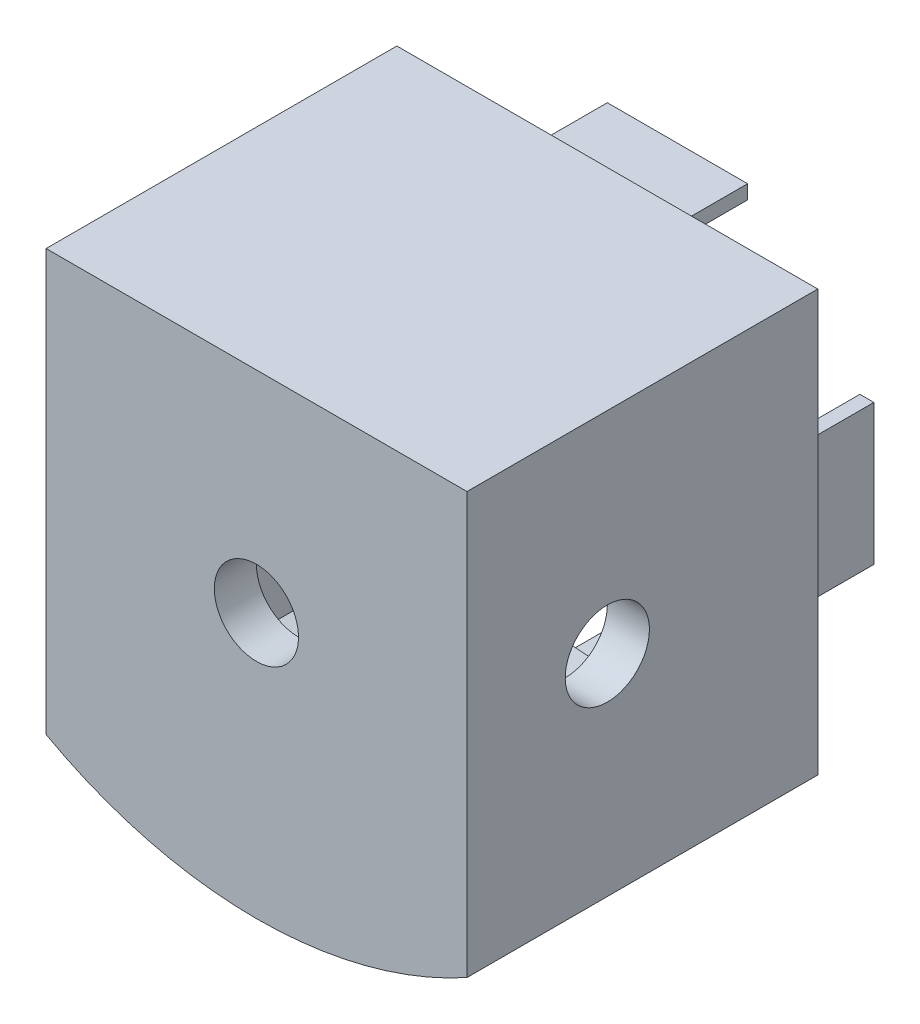
ISO-10303-21;
HEADER;
FILE_DESCRIPTION(('STEP AP214'),'2;1');
FILE_NAME('part.step','',(''),(''),'','','');
FILE_SCHEMA(('AUTOMOTIVE_DESIGN { 1 0 10303 214 1 1 1 1 }'));
ENDSEC;
DATA;
#1=APPLICATION_CONTEXT('core data for automotive mechanical design processes');
#2=APPLICATION_PROTOCOL_DEFINITION('international standard','automotive_design',2000,#1);
#3=PRODUCT_CONTEXT('',#1,'mechanical');
#4=PRODUCT('Part','Part','',(#3));
#5=PRODUCT_RELATED_PRODUCT_CATEGORY('part','',(#4));
#6=PRODUCT_DEFINITION_FORMATION('','',#4);
#7=PRODUCT_DEFINITION_CONTEXT('part definition',#1,'design');
#8=PRODUCT_DEFINITION('design','',#6,#7);
#9=PRODUCT_DEFINITION_SHAPE('','',#8);
#10=(LENGTH_UNIT() NAMED_UNIT(*) SI_UNIT(.MILLI.,.METRE.));
#11=(NAMED_UNIT(*) PLANE_ANGLE_UNIT() SI_UNIT($,.RADIAN.));
#12=(NAMED_UNIT(*) SI_UNIT($,.STERADIAN.) SOLID_ANGLE_UNIT());
#13=UNCERTAINTY_MEASURE_WITH_UNIT(LENGTH_MEASURE(1.E-05),#10,'distance_accuracy_value','');
#14=(GEOMETRIC_REPRESENTATION_CONTEXT(3) GLOBAL_UNCERTAINTY_ASSIGNED_CONTEXT((#13)) GLOBAL_UNIT_ASSIGNED_CONTEXT((#10,
#11,#12)) REPRESENTATION_CONTEXT('',''));
#15=CARTESIAN_POINT('',(0.,0.,0.));
#16=DIRECTION('',(0.,0.,1.));
#17=DIRECTION('',(1.,0.,0.));
#18=AXIS2_PLACEMENT_3D('',#15,#16,#17);
#19=CARTESIAN_POINT('',(0.,12.1293199325011,0.));
#20=DIRECTION('',(0.,0.,1.));
#21=DIRECTION('',(1.,0.,0.));
#22=AXIS2_PLACEMENT_3D('',#19,#20,#21);
#23=PLANE('',#22);
#24=DIRECTION('',(0.,-1.,0.));
#25=VECTOR('',#24,1.);
#26=CARTESIAN_POINT('',(3.5,-17.,0.));
#27=LINE('',#26,#25);
#28=CARTESIAN_POINT('',(3.5,-17.,0.));
#29=VERTEX_POINT('',#28);
#30=CARTESIAN_POINT('',(3.5,-18.,0.));
#31=VERTEX_POINT('',#30);
#32=EDGE_CURVE('E218',#29,#31,#27,.T.);
#33=ORIENTED_EDGE('',*,*,#32,.F.);
#34=DIRECTION('',(1.,0.,0.));
#35=VECTOR('',#34,1.);
#36=CARTESIAN_POINT('',(3.5,-17.,0.));
#37=LINE('',#36,#35);
#38=CARTESIAN_POINT('',(-3.5,-17.,0.));
#39=VERTEX_POINT('',#38);
#40=EDGE_CURVE('E231',#39,#29,#37,.T.);
#41=ORIENTED_EDGE('',*,*,#40,.F.);
#42=DIRECTION('',(0.,1.,0.));
#43=VECTOR('',#42,1.);
#44=CARTESIAN_POINT('',(-3.5,-17.,0.));
#45=LINE('',#44,#43);
#46=CARTESIAN_POINT('',(-3.5,-18.,0.));
#47=VERTEX_POINT('',#46);
#48=EDGE_CURVE('E240',#47,#39,#45,.T.);
#49=ORIENTED_EDGE('',*,*,#48,.F.);
#50=DIRECTION('',(-1.,0.,0.));
#51=VECTOR('',#50,1.);
#52=CARTESIAN_POINT('',(3.5,-18.,0.));
#53=LINE('',#52,#51);
#54=EDGE_CURVE('E221',#31,#47,#53,.T.);
#55=ORIENTED_EDGE('',*,*,#54,.F.);
#56=EDGE_LOOP('',(#33,#41,#49,#55));
#57=FACE_BOUND('',#56,.T.);
#58=DIRECTION('',(0.,-1.,0.));
#59=VECTOR('',#58,1.);
#60=CARTESIAN_POINT('',(5.,14.,0.));
#61=LINE('',#60,#59);
#62=CARTESIAN_POINT('',(5.,14.,0.));
#63=VERTEX_POINT('',#62);
#64=CARTESIAN_POINT('',(5.,13.,0.));
#65=VERTEX_POINT('',#64);
#66=EDGE_CURVE('E289',#63,#65,#61,.T.);
#67=ORIENTED_EDGE('',*,*,#66,.F.);
#68=DIRECTION('',(1.,0.,0.));
#69=VECTOR('',#68,1.);
#70=CARTESIAN_POINT('',(5.,14.,0.));
#71=LINE('',#70,#69);
#72=CARTESIAN_POINT('',(-5.,14.,0.));
#73=VERTEX_POINT('',#72);
#74=EDGE_CURVE('E294',#73,#63,#71,.T.);
#75=ORIENTED_EDGE('',*,*,#74,.F.);
#76=DIRECTION('',(0.,1.,0.));
#77=VECTOR('',#76,1.);
#78=CARTESIAN_POINT('',(-5.,14.,0.));
#79=LINE('',#78,#77);
#80=CARTESIAN_POINT('',(-5.,13.,0.));
#81=VERTEX_POINT('',#80);
#82=EDGE_CURVE('E306',#81,#73,#79,.T.);
#83=ORIENTED_EDGE('',*,*,#82,.F.);
#84=DIRECTION('',(-1.,0.,0.));
#85=VECTOR('',#84,1.);
#86=CARTESIAN_POINT('',(5.,13.,0.));
#87=LINE('',#86,#85);
#88=EDGE_CURVE('E303',#65,#81,#87,.T.);
#89=ORIENTED_EDGE('',*,*,#88,.F.);
#90=EDGE_LOOP('',(#67,#75,#83,#89));
#91=FACE_BOUND('',#90,.T.);
#92=DIRECTION('',(-1.,0.,0.));
#93=VECTOR('',#92,1.);
#94=CARTESIAN_POINT('',(15.,12.,0.));
#95=LINE('',#94,#93);
#96=CARTESIAN_POINT('',(12.,12.,0.));
#97=VERTEX_POINT('',#96);
#98=CARTESIAN_POINT('',(-12.,12.,0.));
#99=VERTEX_POINT('',#98);
#100=EDGE_CURVE('E338',#97,#99,#95,.T.);
#101=ORIENTED_EDGE('',*,*,#100,.T.);
#102=DIRECTION('',(0.,-1.,0.));
#103=VECTOR('',#102,1.);
#104=CARTESIAN_POINT('',(-12.,-15.,0.));
#105=LINE('',#104,#103);
#106=CARTESIAN_POINT('',(-12.,-13.1689013488459,0.));
#107=VERTEX_POINT('',#106);
#108=EDGE_CURVE('E326',#99,#107,#105,.T.);
#109=ORIENTED_EDGE('',*,*,#108,.T.);
#110=CARTESIAN_POINT('',(0.,12.1293199325011,0.));
#111=DIRECTION('',(0.,0.,1.));
#112=DIRECTION('',(1.,0.,0.));
#113=AXIS2_PLACEMENT_3D('',#110,#111,#112);
#114=CIRCLE('',#113,28.);
#115=CARTESIAN_POINT('',(12.,-13.168901348846,0.));
#116=VERTEX_POINT('',#115);
#117=EDGE_CURVE('E352',#107,#116,#114,.T.);
#118=ORIENTED_EDGE('',*,*,#117,.T.);
#119=DIRECTION('',(0.,1.,0.));
#120=VECTOR('',#119,1.);
#121=CARTESIAN_POINT('',(12.,-15.,0.));
#122=LINE('',#121,#120);
#123=EDGE_CURVE('E355',#116,#97,#122,.T.);
#124=ORIENTED_EDGE('',*,*,#123,.T.);
#125=EDGE_LOOP('',(#101,#109,#118,#124));
#126=FACE_BOUND('',#125,.T.);
#127=DIRECTION('',(0.,-1.,0.));
#128=VECTOR('',#127,1.);
#129=CARTESIAN_POINT('',(-15.,-15.,0.));
#130=LINE('',#129,#128);
#131=CARTESIAN_POINT('',(-15.,15.,0.));
#132=VERTEX_POINT('',#131);
#133=CARTESIAN_POINT('',(-15.,-15.,0.));
#134=VERTEX_POINT('',#133);
#135=EDGE_CURVE('E332',#132,#134,#130,.T.);
#136=ORIENTED_EDGE('',*,*,#135,.F.);
#137=DIRECTION('',(-1.,0.,0.));
#138=VECTOR('',#137,1.);
#139=CARTESIAN_POINT('',(15.,15.,0.));
#140=LINE('',#139,#138);
#141=CARTESIAN_POINT('',(15.,15.,0.));
#142=VERTEX_POINT('',#141);
#143=EDGE_CURVE('E364',#142,#132,#140,.T.);
#144=ORIENTED_EDGE('',*,*,#143,.F.);
#145=DIRECTION('',(0.,1.,0.));
#146=VECTOR('',#145,1.);
#147=CARTESIAN_POINT('',(15.,-15.,0.));
#148=LINE('',#147,#146);
#149=CARTESIAN_POINT('',(15.,-15.,0.));
#150=VERTEX_POINT('',#149);
#151=EDGE_CURVE('E375',#150,#142,#148,.T.);
#152=ORIENTED_EDGE('',*,*,#151,.F.);
#153=CARTESIAN_POINT('',(0.,12.1293199325011,0.));
#154=DIRECTION('',(0.,0.,1.));
#155=DIRECTION('',(1.,0.,0.));
#156=AXIS2_PLACEMENT_3D('',#153,#154,#155);
#157=CIRCLE('',#156,31.);
#158=EDGE_CURVE('E373',#134,#150,#157,.T.);
#159=ORIENTED_EDGE('',*,*,#158,.F.);
#160=EDGE_LOOP('',(#136,#144,#152,#159));
#161=FACE_BOUND('',#160,.T.);
#162=DIRECTION('',(0.,-1.,0.));
#163=VECTOR('',#162,1.);
#164=CARTESIAN_POINT('',(14.,5.,0.));
#165=LINE('',#164,#163);
#166=CARTESIAN_POINT('',(14.,5.,0.));
#167=VERTEX_POINT('',#166);
#168=CARTESIAN_POINT('',(14.,-5.,0.));
#169=VERTEX_POINT('',#168);
#170=EDGE_CURVE('E256',#167,#169,#165,.T.);
#171=ORIENTED_EDGE('',*,*,#170,.F.);
#172=DIRECTION('',(1.,0.,0.));
#173=VECTOR('',#172,1.);
#174=CARTESIAN_POINT('',(14.,5.,0.));
#175=LINE('',#174,#173);
#176=CARTESIAN_POINT('',(13.,5.,0.));
#177=VERTEX_POINT('',#176);
#178=EDGE_CURVE('E261',#177,#167,#175,.T.);
#179=ORIENTED_EDGE('',*,*,#178,.F.);
#180=DIRECTION('',(0.,1.,0.));
#181=VECTOR('',#180,1.);
#182=CARTESIAN_POINT('',(13.,5.,0.));
#183=LINE('',#182,#181);
#184=CARTESIAN_POINT('',(13.,-5.,0.));
#185=VERTEX_POINT('',#184);
#186=EDGE_CURVE('E273',#185,#177,#183,.T.);
#187=ORIENTED_EDGE('',*,*,#186,.F.);
#188=DIRECTION('',(-1.,0.,0.));
#189=VECTOR('',#188,1.);
#190=CARTESIAN_POINT('',(14.,-5.,0.));
#191=LINE('',#190,#189);
#192=EDGE_CURVE('E270',#169,#185,#191,.T.);
#193=ORIENTED_EDGE('',*,*,#192,.F.);
#194=EDGE_LOOP('',(#171,#179,#187,#193));
#195=FACE_BOUND('',#194,.T.);
#196=DIRECTION('',(0.,-1.,0.));
#197=VECTOR('',#196,1.);
#198=CARTESIAN_POINT('',(-13.,5.,0.));
#199=LINE('',#198,#197);
#200=CARTESIAN_POINT('',(-13.,5.,0.));
#201=VERTEX_POINT('',#200);
#202=CARTESIAN_POINT('',(-13.,-5.,0.));
#203=VERTEX_POINT('',#202);
#204=EDGE_CURVE('E217',#201,#203,#199,.T.);
#205=ORIENTED_EDGE('',*,*,#204,.F.);
#206=DIRECTION('',(1.,0.,0.));
#207=VECTOR('',#206,1.);
#208=CARTESIAN_POINT('',(-13.,5.,0.));
#209=LINE('',#208,#207);
#210=CARTESIAN_POINT('',(-14.,5.,0.));
#211=VERTEX_POINT('',#210);
#212=EDGE_CURVE('E214',#211,#201,#209,.T.);
#213=ORIENTED_EDGE('',*,*,#212,.F.);
#214=DIRECTION('',(0.,1.,0.));
#215=VECTOR('',#214,1.);
#216=CARTESIAN_POINT('',(-14.,5.,0.));
#217=LINE('',#216,#215);
#218=CARTESIAN_POINT('',(-14.,-5.,0.));
#219=VERTEX_POINT('',#218);
#220=EDGE_CURVE('E56',#219,#211,#217,.T.);
#221=ORIENTED_EDGE('',*,*,#220,.F.);
#222=DIRECTION('',(-1.,0.,0.));
#223=VECTOR('',#222,1.);
#224=CARTESIAN_POINT('',(-13.,-5.,0.));
#225=LINE('',#224,#223);
#226=EDGE_CURVE('E51',#203,#219,#225,.T.);
#227=ORIENTED_EDGE('',*,*,#226,.F.);
#228=EDGE_LOOP('',(#205,#213,#221,#227));
#229=FACE_BOUND('',#228,.T.);
#230=ADVANCED_FACE('F35',(#57,#91,#126,#161,#195,#229),#23,.F.);
#231=CARTESIAN_POINT('',(-15.,-15.,25.));
#232=DIRECTION('',(1.,0.,0.));
#233=DIRECTION('',(0.,1.,0.));
#234=AXIS2_PLACEMENT_3D('',#231,#232,#233);
#235=PLANE('',#234);
#236=CARTESIAN_POINT('',(-15.,0.,15.));
#237=DIRECTION('',(1.,0.,0.));
#238=DIRECTION('',(0.,1.,0.));
#239=AXIS2_PLACEMENT_3D('',#236,#237,#238);
#240=CIRCLE('',#239,3.);
#241=CARTESIAN_POINT('',(-15.,3.,15.));
#242=VERTEX_POINT('',#241);
#243=EDGE_CURVE('E562',#242,#242,#240,.T.);
#244=ORIENTED_EDGE('',*,*,#243,.T.);
#245=EDGE_LOOP('',(#244));
#246=FACE_BOUND('',#245,.T.);
#247=ORIENTED_EDGE('',*,*,#135,.T.);
#248=DIRECTION('',(0.,0.,-1.));
#249=VECTOR('',#248,1.);
#250=CARTESIAN_POINT('',(-15.,-15.,25.));
#251=LINE('',#250,#249);
#252=CARTESIAN_POINT('',(-15.,-15.,25.));
#253=VERTEX_POINT('',#252);
#254=EDGE_CURVE('E11',#253,#134,#251,.T.);
#255=ORIENTED_EDGE('',*,*,#254,.F.);
#256=DIRECTION('',(0.,-1.,0.));
#257=VECTOR('',#256,1.);
#258=CARTESIAN_POINT('',(-15.,-15.,25.));
#259=LINE('',#258,#257);
#260=CARTESIAN_POINT('',(-15.,15.,25.));
#261=VERTEX_POINT('',#260);
#262=EDGE_CURVE('E360',#261,#253,#259,.T.);
#263=ORIENTED_EDGE('',*,*,#262,.F.);
#264=DIRECTION('',(0.,0.,-1.));
#265=VECTOR('',#264,1.);
#266=CARTESIAN_POINT('',(-15.,15.,25.));
#267=LINE('',#266,#265);
#268=EDGE_CURVE('E370',#261,#132,#267,.T.);
#269=ORIENTED_EDGE('',*,*,#268,.T.);
#270=EDGE_LOOP('',(#247,#255,#263,#269));
#271=FACE_BOUND('',#270,.T.);
#272=ADVANCED_FACE('F37',(#246,#271),#235,.F.);
#273=CARTESIAN_POINT('',(0.,12.1293199325011,25.));
#274=DIRECTION('',(0.,0.,-1.));
#275=DIRECTION('',(-1.,0.,0.));
#276=AXIS2_PLACEMENT_3D('',#273,#274,#275);
#277=CYLINDRICAL_SURFACE('',#276,31.);
#278=ORIENTED_EDGE('',*,*,#158,.T.);
#279=DIRECTION('',(0.,0.,-1.));
#280=VECTOR('',#279,1.);
#281=CARTESIAN_POINT('',(15.,-15.,25.));
#282=LINE('',#281,#280);
#283=CARTESIAN_POINT('',(15.,-15.,25.));
#284=VERTEX_POINT('',#283);
#285=EDGE_CURVE('E44',#284,#150,#282,.T.);
#286=ORIENTED_EDGE('',*,*,#285,.F.);
#287=CARTESIAN_POINT('',(0.,12.1293199325011,25.));
#288=DIRECTION('',(0.,0.,1.));
#289=DIRECTION('',(1.,0.,0.));
#290=AXIS2_PLACEMENT_3D('',#287,#288,#289);
#291=CIRCLE('',#290,31.);
#292=EDGE_CURVE('E363',#253,#284,#291,.T.);
#293=ORIENTED_EDGE('',*,*,#292,.F.);
#294=ORIENTED_EDGE('',*,*,#254,.T.);
#295=EDGE_LOOP('',(#278,#286,#293,#294));
#296=FACE_BOUND('',#295,.T.);
#297=ADVANCED_FACE('F404',(#296),#277,.T.);
#298=CARTESIAN_POINT('',(15.,-15.,25.));
#299=DIRECTION('',(-1.,0.,0.));
#300=DIRECTION('',(0.,-1.,0.));
#301=AXIS2_PLACEMENT_3D('',#298,#299,#300);
#302=PLANE('',#301);
#303=CARTESIAN_POINT('',(15.,0.,15.));
#304=DIRECTION('',(1.,0.,0.));
#305=DIRECTION('',(0.,1.,0.));
#306=AXIS2_PLACEMENT_3D('',#303,#304,#305);
#307=CIRCLE('',#306,3.);
#308=CARTESIAN_POINT('',(15.,3.,15.));
#309=VERTEX_POINT('',#308);
#310=EDGE_CURVE('E561',#309,#309,#307,.T.);
#311=ORIENTED_EDGE('',*,*,#310,.F.);
#312=EDGE_LOOP('',(#311));
#313=FACE_BOUND('',#312,.T.);
#314=ORIENTED_EDGE('',*,*,#151,.T.);
#315=DIRECTION('',(0.,0.,-1.));
#316=VECTOR('',#315,1.);
#317=CARTESIAN_POINT('',(15.,15.,25.));
#318=LINE('',#317,#316);
#319=CARTESIAN_POINT('',(15.,15.,25.));
#320=VERTEX_POINT('',#319);
#321=EDGE_CURVE('E380',#320,#142,#318,.T.);
#322=ORIENTED_EDGE('',*,*,#321,.F.);
#323=DIRECTION('',(0.,1.,0.));
#324=VECTOR('',#323,1.);
#325=CARTESIAN_POINT('',(15.,-15.,25.));
#326=LINE('',#325,#324);
#327=EDGE_CURVE('E366',#284,#320,#326,.T.);
#328=ORIENTED_EDGE('',*,*,#327,.F.);
#329=ORIENTED_EDGE('',*,*,#285,.T.);
#330=EDGE_LOOP('',(#314,#322,#328,#329));
#331=FACE_BOUND('',#330,.T.);
#332=ADVANCED_FACE('F388',(#313,#331),#302,.F.);
#333=CARTESIAN_POINT('',(15.,15.,25.));
#334=DIRECTION('',(0.,-1.,0.));
#335=DIRECTION('',(0.,0.,-1.));
#336=AXIS2_PLACEMENT_3D('',#333,#334,#335);
#337=PLANE('',#336);
#338=ORIENTED_EDGE('',*,*,#143,.T.);
#339=ORIENTED_EDGE('',*,*,#268,.F.);
#340=DIRECTION('',(-1.,0.,0.));
#341=VECTOR('',#340,1.);
#342=CARTESIAN_POINT('',(15.,15.,25.));
#343=LINE('',#342,#341);
#344=EDGE_CURVE('E368',#320,#261,#343,.T.);
#345=ORIENTED_EDGE('',*,*,#344,.F.);
#346=ORIENTED_EDGE('',*,*,#321,.T.);
#347=EDGE_LOOP('',(#338,#339,#345,#346));
#348=FACE_BOUND('',#347,.T.);
#349=ADVANCED_FACE('F397',(#348),#337,.F.);
#350=CARTESIAN_POINT('',(0.,12.1293199325011,25.));
#351=DIRECTION('',(0.,0.,1.));
#352=DIRECTION('',(1.,0.,0.));
#353=AXIS2_PLACEMENT_3D('',#350,#351,#352);
#354=PLANE('',#353);
#355=CARTESIAN_POINT('',(-0.0102597379063596,0.00757269740248034,25.));
#356=DIRECTION('',(0.,0.,-1.));
#357=DIRECTION('',(-1.,0.,0.));
#358=AXIS2_PLACEMENT_3D('',#355,#356,#357);
#359=CIRCLE('',#358,3.);
#360=CARTESIAN_POINT('',(-3.01025973790636,0.00757269740248034,25.));
#361=VERTEX_POINT('',#360);
#362=EDGE_CURVE('E323',#361,#361,#359,.T.);
#363=ORIENTED_EDGE('',*,*,#362,.T.);
#364=EDGE_LOOP('',(#363));
#365=FACE_BOUND('',#364,.T.);
#366=ORIENTED_EDGE('',*,*,#262,.T.);
#367=ORIENTED_EDGE('',*,*,#292,.T.);
#368=ORIENTED_EDGE('',*,*,#327,.T.);
#369=ORIENTED_EDGE('',*,*,#344,.T.);
#370=EDGE_LOOP('',(#366,#367,#368,#369));
#371=FACE_BOUND('',#370,.T.);
#372=ADVANCED_FACE('F403',(#365,#371),#354,.T.);
#373=CARTESIAN_POINT('',(-12.,-15.,25.));
#374=DIRECTION('',(1.,0.,0.));
#375=DIRECTION('',(0.,1.,0.));
#376=AXIS2_PLACEMENT_3D('',#373,#374,#375);
#377=PLANE('',#376);
#378=CARTESIAN_POINT('',(-12.,0.,15.));
#379=DIRECTION('',(1.,0.,0.));
#380=DIRECTION('',(0.,1.,0.));
#381=AXIS2_PLACEMENT_3D('',#378,#379,#380);
#382=CIRCLE('',#381,3.);
#383=CARTESIAN_POINT('',(-12.,3.,15.));
#384=VERTEX_POINT('',#383);
#385=EDGE_CURVE('E567',#384,#384,#382,.T.);
#386=ORIENTED_EDGE('',*,*,#385,.F.);
#387=EDGE_LOOP('',(#386));
#388=FACE_BOUND('',#387,.T.);
#389=ORIENTED_EDGE('',*,*,#108,.F.);
#390=DIRECTION('',(0.,0.,-1.));
#391=VECTOR('',#390,1.);
#392=CARTESIAN_POINT('',(-12.,12.,25.));
#393=LINE('',#392,#391);
#394=CARTESIAN_POINT('',(-12.,12.,22.));
#395=VERTEX_POINT('',#394);
#396=EDGE_CURVE('E339',#395,#99,#393,.T.);
#397=ORIENTED_EDGE('',*,*,#396,.F.);
#398=DIRECTION('',(0.,-1.,0.));
#399=VECTOR('',#398,1.);
#400=CARTESIAN_POINT('',(-12.,-15.,22.));
#401=LINE('',#400,#399);
#402=CARTESIAN_POINT('',(-12.,-13.1689013488459,22.));
#403=VERTEX_POINT('',#402);
#404=EDGE_CURVE('E334',#395,#403,#401,.T.);
#405=ORIENTED_EDGE('',*,*,#404,.T.);
#406=DIRECTION('',(0.,0.,-1.));
#407=VECTOR('',#406,1.);
#408=CARTESIAN_POINT('',(-12.,-13.1689013488459,22.));
#409=LINE('',#408,#407);
#410=EDGE_CURVE('E329',#403,#107,#409,.T.);
#411=ORIENTED_EDGE('',*,*,#410,.T.);
#412=EDGE_LOOP('',(#389,#397,#405,#411));
#413=FACE_BOUND('',#412,.T.);
#414=ADVANCED_FACE('F428',(#388,#413),#377,.T.);
#415=CARTESIAN_POINT('',(0.,12.1293199325011,25.));
#416=DIRECTION('',(0.,0.,-1.));
#417=DIRECTION('',(-1.,0.,0.));
#418=AXIS2_PLACEMENT_3D('',#415,#416,#417);
#419=CYLINDRICAL_SURFACE('',#418,28.);
#420=ORIENTED_EDGE('',*,*,#117,.F.);
#421=ORIENTED_EDGE('',*,*,#410,.F.);
#422=CARTESIAN_POINT('',(0.,12.1293199325011,22.));
#423=DIRECTION('',(0.,0.,1.));
#424=DIRECTION('',(1.,0.,0.));
#425=AXIS2_PLACEMENT_3D('',#422,#423,#424);
#426=CIRCLE('',#425,28.);
#427=CARTESIAN_POINT('',(12.,-13.168901348846,22.));
#428=VERTEX_POINT('',#427);
#429=EDGE_CURVE('E337',#403,#428,#426,.T.);
#430=ORIENTED_EDGE('',*,*,#429,.T.);
#431=DIRECTION('',(0.,0.,-1.));
#432=VECTOR('',#431,1.);
#433=CARTESIAN_POINT('',(12.,-13.168901348846,22.));
#434=LINE('',#433,#432);
#435=EDGE_CURVE('E333',#428,#116,#434,.T.);
#436=ORIENTED_EDGE('',*,*,#435,.T.);
#437=EDGE_LOOP('',(#420,#421,#430,#436));
#438=FACE_BOUND('',#437,.T.);
#439=ADVANCED_FACE('F434',(#438),#419,.F.);
#440=CARTESIAN_POINT('',(12.,-15.,25.));
#441=DIRECTION('',(-1.,0.,0.));
#442=DIRECTION('',(0.,-1.,0.));
#443=AXIS2_PLACEMENT_3D('',#440,#441,#442);
#444=PLANE('',#443);
#445=CARTESIAN_POINT('',(12.,0.,15.));
#446=DIRECTION('',(-1.,0.,0.));
#447=DIRECTION('',(0.,-1.,0.));
#448=AXIS2_PLACEMENT_3D('',#445,#446,#447);
#449=CIRCLE('',#448,3.);
#450=CARTESIAN_POINT('',(12.,-3.,15.));
#451=VERTEX_POINT('',#450);
#452=EDGE_CURVE('E39',#451,#451,#449,.T.);
#453=ORIENTED_EDGE('',*,*,#452,.F.);
#454=EDGE_LOOP('',(#453));
#455=FACE_BOUND('',#454,.T.);
#456=ORIENTED_EDGE('',*,*,#123,.F.);
#457=ORIENTED_EDGE('',*,*,#435,.F.);
#458=DIRECTION('',(0.,1.,0.));
#459=VECTOR('',#458,1.);
#460=CARTESIAN_POINT('',(12.,-15.,22.));
#461=LINE('',#460,#459);
#462=CARTESIAN_POINT('',(12.,12.,22.));
#463=VERTEX_POINT('',#462);
#464=EDGE_CURVE('E346',#428,#463,#461,.T.);
#465=ORIENTED_EDGE('',*,*,#464,.T.);
#466=DIRECTION('',(0.,0.,-1.));
#467=VECTOR('',#466,1.);
#468=CARTESIAN_POINT('',(12.,12.,25.));
#469=LINE('',#468,#467);
#470=EDGE_CURVE('E341',#463,#97,#469,.T.);
#471=ORIENTED_EDGE('',*,*,#470,.T.);
#472=EDGE_LOOP('',(#456,#457,#465,#471));
#473=FACE_BOUND('',#472,.T.);
#474=ADVANCED_FACE('F464',(#455,#473),#444,.T.);
#475=CARTESIAN_POINT('',(15.,12.,25.));
#476=DIRECTION('',(0.,-1.,0.));
#477=DIRECTION('',(0.,0.,-1.));
#478=AXIS2_PLACEMENT_3D('',#475,#476,#477);
#479=PLANE('',#478);
#480=ORIENTED_EDGE('',*,*,#100,.F.);
#481=ORIENTED_EDGE('',*,*,#470,.F.);
#482=DIRECTION('',(-1.,0.,0.));
#483=VECTOR('',#482,1.);
#484=CARTESIAN_POINT('',(15.,12.,22.));
#485=LINE('',#484,#483);
#486=EDGE_CURVE('E342',#463,#395,#485,.T.);
#487=ORIENTED_EDGE('',*,*,#486,.T.);
#488=ORIENTED_EDGE('',*,*,#396,.T.);
#489=EDGE_LOOP('',(#480,#481,#487,#488));
#490=FACE_BOUND('',#489,.T.);
#491=ADVANCED_FACE('F449',(#490),#479,.T.);
#492=CARTESIAN_POINT('',(0.,12.1293199325011,22.));
#493=DIRECTION('',(0.,0.,1.));
#494=DIRECTION('',(1.,0.,0.));
#495=AXIS2_PLACEMENT_3D('',#492,#493,#494);
#496=PLANE('',#495);
#497=CARTESIAN_POINT('',(-0.0102597379063596,0.00757269740248034,22.));
#498=DIRECTION('',(0.,0.,-1.));
#499=DIRECTION('',(-1.,0.,0.));
#500=AXIS2_PLACEMENT_3D('',#497,#498,#499);
#501=CIRCLE('',#500,3.);
#502=CARTESIAN_POINT('',(-3.01025973790636,0.00757269740248034,22.));
#503=VERTEX_POINT('',#502);
#504=EDGE_CURVE('E322',#503,#503,#501,.T.);
#505=ORIENTED_EDGE('',*,*,#504,.F.);
#506=EDGE_LOOP('',(#505));
#507=FACE_BOUND('',#506,.T.);
#508=ORIENTED_EDGE('',*,*,#404,.F.);
#509=ORIENTED_EDGE('',*,*,#486,.F.);
#510=ORIENTED_EDGE('',*,*,#464,.F.);
#511=ORIENTED_EDGE('',*,*,#429,.F.);
#512=EDGE_LOOP('',(#508,#509,#510,#511));
#513=FACE_BOUND('',#512,.T.);
#514=ADVANCED_FACE('F443',(#507,#513),#496,.F.);
#515=CARTESIAN_POINT('',(-0.0102597379063596,0.00757269740248034,25.));
#516=DIRECTION('',(0.,0.,-1.));
#517=DIRECTION('',(-1.,0.,0.));
#518=AXIS2_PLACEMENT_3D('',#515,#516,#517);
#519=CYLINDRICAL_SURFACE('',#518,3.);
#520=ORIENTED_EDGE('',*,*,#362,.F.);
#521=EDGE_LOOP('',(#520));
#522=FACE_BOUND('',#521,.T.);
#523=ORIENTED_EDGE('',*,*,#504,.T.);
#524=EDGE_LOOP('',(#523));
#525=FACE_BOUND('',#524,.T.);
#526=ADVANCED_FACE('F439',(#522,#525),#519,.F.);
#527=CARTESIAN_POINT('',(5.,14.,-5.));
#528=DIRECTION('',(-1.,0.,0.));
#529=DIRECTION('',(0.,0.,1.));
#530=AXIS2_PLACEMENT_3D('',#527,#528,#529);
#531=PLANE('',#530);
#532=ORIENTED_EDGE('',*,*,#66,.T.);
#533=DIRECTION('',(0.,0.,1.));
#534=VECTOR('',#533,1.);
#535=CARTESIAN_POINT('',(5.,13.,-5.));
#536=LINE('',#535,#534);
#537=CARTESIAN_POINT('',(5.,13.,-5.));
#538=VERTEX_POINT('',#537);
#539=EDGE_CURVE('E319',#538,#65,#536,.T.);
#540=ORIENTED_EDGE('',*,*,#539,.F.);
#541=DIRECTION('',(0.,-1.,0.));
#542=VECTOR('',#541,1.);
#543=CARTESIAN_POINT('',(5.,14.,-5.));
#544=LINE('',#543,#542);
#545=CARTESIAN_POINT('',(5.,14.,-5.));
#546=VERTEX_POINT('',#545);
#547=EDGE_CURVE('E290',#546,#538,#544,.T.);
#548=ORIENTED_EDGE('',*,*,#547,.F.);
#549=DIRECTION('',(0.,0.,1.));
#550=VECTOR('',#549,1.);
#551=CARTESIAN_POINT('',(5.,14.,-5.));
#552=LINE('',#551,#550);
#553=EDGE_CURVE('E300',#546,#63,#552,.T.);
#554=ORIENTED_EDGE('',*,*,#553,.T.);
#555=EDGE_LOOP('',(#532,#540,#548,#554));
#556=FACE_BOUND('',#555,.T.);
#557=ADVANCED_FACE('F442',(#556),#531,.F.);
#558=CARTESIAN_POINT('',(5.,13.,-5.));
#559=DIRECTION('',(0.,1.,0.));
#560=DIRECTION('',(0.,0.,1.));
#561=AXIS2_PLACEMENT_3D('',#558,#559,#560);
#562=PLANE('',#561);
#563=ORIENTED_EDGE('',*,*,#88,.T.);
#564=DIRECTION('',(0.,0.,1.));
#565=VECTOR('',#564,1.);
#566=CARTESIAN_POINT('',(-5.,13.,-5.));
#567=LINE('',#566,#565);
#568=CARTESIAN_POINT('',(-5.,13.,-5.));
#569=VERTEX_POINT('',#568);
#570=EDGE_CURVE('E316',#569,#81,#567,.T.);
#571=ORIENTED_EDGE('',*,*,#570,.F.);
#572=DIRECTION('',(-1.,0.,0.));
#573=VECTOR('',#572,1.);
#574=CARTESIAN_POINT('',(5.,13.,-5.));
#575=LINE('',#574,#573);
#576=EDGE_CURVE('E293',#538,#569,#575,.T.);
#577=ORIENTED_EDGE('',*,*,#576,.F.);
#578=ORIENTED_EDGE('',*,*,#539,.T.);
#579=EDGE_LOOP('',(#563,#571,#577,#578));
#580=FACE_BOUND('',#579,.T.);
#581=ADVANCED_FACE('F479',(#580),#562,.F.);
#582=CARTESIAN_POINT('',(-5.,14.,-5.));
#583=DIRECTION('',(1.,0.,0.));
#584=DIRECTION('',(0.,0.,-1.));
#585=AXIS2_PLACEMENT_3D('',#582,#583,#584);
#586=PLANE('',#585);
#587=ORIENTED_EDGE('',*,*,#82,.T.);
#588=DIRECTION('',(0.,0.,1.));
#589=VECTOR('',#588,1.);
#590=CARTESIAN_POINT('',(-5.,14.,-5.));
#591=LINE('',#590,#589);
#592=CARTESIAN_POINT('',(-5.,14.,-5.));
#593=VERTEX_POINT('',#592);
#594=EDGE_CURVE('E313',#593,#73,#591,.T.);
#595=ORIENTED_EDGE('',*,*,#594,.F.);
#596=DIRECTION('',(0.,1.,0.));
#597=VECTOR('',#596,1.);
#598=CARTESIAN_POINT('',(-5.,14.,-5.));
#599=LINE('',#598,#597);
#600=EDGE_CURVE('E296',#569,#593,#599,.T.);
#601=ORIENTED_EDGE('',*,*,#600,.F.);
#602=ORIENTED_EDGE('',*,*,#570,.T.);
#603=EDGE_LOOP('',(#587,#595,#601,#602));
#604=FACE_BOUND('',#603,.T.);
#605=ADVANCED_FACE('F483',(#604),#586,.F.);
#606=CARTESIAN_POINT('',(5.,14.,-5.));
#607=DIRECTION('',(0.,-1.,0.));
#608=DIRECTION('',(0.,0.,-1.));
#609=AXIS2_PLACEMENT_3D('',#606,#607,#608);
#610=PLANE('',#609);
#611=ORIENTED_EDGE('',*,*,#74,.T.);
#612=ORIENTED_EDGE('',*,*,#553,.F.);
#613=DIRECTION('',(1.,0.,0.));
#614=VECTOR('',#613,1.);
#615=CARTESIAN_POINT('',(5.,14.,-5.));
#616=LINE('',#615,#614);
#617=EDGE_CURVE('E298',#593,#546,#616,.T.);
#618=ORIENTED_EDGE('',*,*,#617,.F.);
#619=ORIENTED_EDGE('',*,*,#594,.T.);
#620=EDGE_LOOP('',(#611,#612,#618,#619));
#621=FACE_BOUND('',#620,.T.);
#622=ADVANCED_FACE('F487',(#621),#610,.F.);
#623=CARTESIAN_POINT('',(0.,0.,-5.));
#624=DIRECTION('',(0.,0.,-1.));
#625=DIRECTION('',(-1.,0.,0.));
#626=AXIS2_PLACEMENT_3D('',#623,#624,#625);
#627=PLANE('',#626);
#628=ORIENTED_EDGE('',*,*,#547,.T.);
#629=ORIENTED_EDGE('',*,*,#576,.T.);
#630=ORIENTED_EDGE('',*,*,#600,.T.);
#631=ORIENTED_EDGE('',*,*,#617,.T.);
#632=EDGE_LOOP('',(#628,#629,#630,#631));
#633=FACE_BOUND('',#632,.T.);
#634=ADVANCED_FACE('F491',(#633),#627,.T.);
#635=CARTESIAN_POINT('',(14.,5.,-5.));
#636=DIRECTION('',(-1.,0.,0.));
#637=DIRECTION('',(0.,0.,1.));
#638=AXIS2_PLACEMENT_3D('',#635,#636,#637);
#639=PLANE('',#638);
#640=ORIENTED_EDGE('',*,*,#170,.T.);
#641=DIRECTION('',(0.,0.,1.));
#642=VECTOR('',#641,1.);
#643=CARTESIAN_POINT('',(14.,-5.,-5.));
#644=LINE('',#643,#642);
#645=CARTESIAN_POINT('',(14.,-5.,-5.));
#646=VERTEX_POINT('',#645);
#647=EDGE_CURVE('E286',#646,#169,#644,.T.);
#648=ORIENTED_EDGE('',*,*,#647,.F.);
#649=DIRECTION('',(0.,-1.,0.));
#650=VECTOR('',#649,1.);
#651=CARTESIAN_POINT('',(14.,5.,-5.));
#652=LINE('',#651,#650);
#653=CARTESIAN_POINT('',(14.,5.,-5.));
#654=VERTEX_POINT('',#653);
#655=EDGE_CURVE('E257',#654,#646,#652,.T.);
#656=ORIENTED_EDGE('',*,*,#655,.F.);
#657=DIRECTION('',(0.,0.,1.));
#658=VECTOR('',#657,1.);
#659=CARTESIAN_POINT('',(14.,5.,-5.));
#660=LINE('',#659,#658);
#661=EDGE_CURVE('E267',#654,#167,#660,.T.);
#662=ORIENTED_EDGE('',*,*,#661,.T.);
#663=EDGE_LOOP('',(#640,#648,#656,#662));
#664=FACE_BOUND('',#663,.T.);
#665=ADVANCED_FACE('F495',(#664),#639,.F.);
#666=CARTESIAN_POINT('',(14.,-5.,-5.));
#667=DIRECTION('',(0.,1.,0.));
#668=DIRECTION('',(0.,0.,1.));
#669=AXIS2_PLACEMENT_3D('',#666,#667,#668);
#670=PLANE('',#669);
#671=ORIENTED_EDGE('',*,*,#192,.T.);
#672=DIRECTION('',(0.,0.,1.));
#673=VECTOR('',#672,1.);
#674=CARTESIAN_POINT('',(13.,-5.,-5.));
#675=LINE('',#674,#673);
#676=CARTESIAN_POINT('',(13.,-5.,-5.));
#677=VERTEX_POINT('',#676);
#678=EDGE_CURVE('E283',#677,#185,#675,.T.);
#679=ORIENTED_EDGE('',*,*,#678,.F.);
#680=DIRECTION('',(-1.,0.,0.));
#681=VECTOR('',#680,1.);
#682=CARTESIAN_POINT('',(14.,-5.,-5.));
#683=LINE('',#682,#681);
#684=EDGE_CURVE('E260',#646,#677,#683,.T.);
#685=ORIENTED_EDGE('',*,*,#684,.F.);
#686=ORIENTED_EDGE('',*,*,#647,.T.);
#687=EDGE_LOOP('',(#671,#679,#685,#686));
#688=FACE_BOUND('',#687,.T.);
#689=ADVANCED_FACE('F499',(#688),#670,.F.);
#690=CARTESIAN_POINT('',(13.,5.,-5.));
#691=DIRECTION('',(1.,0.,0.));
#692=DIRECTION('',(0.,0.,-1.));
#693=AXIS2_PLACEMENT_3D('',#690,#691,#692);
#694=PLANE('',#693);
#695=ORIENTED_EDGE('',*,*,#186,.T.);
#696=DIRECTION('',(0.,0.,1.));
#697=VECTOR('',#696,1.);
#698=CARTESIAN_POINT('',(13.,5.,-5.));
#699=LINE('',#698,#697);
#700=CARTESIAN_POINT('',(13.,5.,-5.));
#701=VERTEX_POINT('',#700);
#702=EDGE_CURVE('E280',#701,#177,#699,.T.);
#703=ORIENTED_EDGE('',*,*,#702,.F.);
#704=DIRECTION('',(0.,1.,0.));
#705=VECTOR('',#704,1.);
#706=CARTESIAN_POINT('',(13.,5.,-5.));
#707=LINE('',#706,#705);
#708=EDGE_CURVE('E263',#677,#701,#707,.T.);
#709=ORIENTED_EDGE('',*,*,#708,.F.);
#710=ORIENTED_EDGE('',*,*,#678,.T.);
#711=EDGE_LOOP('',(#695,#703,#709,#710));
#712=FACE_BOUND('',#711,.T.);
#713=ADVANCED_FACE('F503',(#712),#694,.F.);
#714=CARTESIAN_POINT('',(14.,5.,-5.));
#715=DIRECTION('',(0.,-1.,0.));
#716=DIRECTION('',(0.,0.,-1.));
#717=AXIS2_PLACEMENT_3D('',#714,#715,#716);
#718=PLANE('',#717);
#719=ORIENTED_EDGE('',*,*,#178,.T.);
#720=ORIENTED_EDGE('',*,*,#661,.F.);
#721=DIRECTION('',(1.,0.,0.));
#722=VECTOR('',#721,1.);
#723=CARTESIAN_POINT('',(14.,5.,-5.));
#724=LINE('',#723,#722);
#725=EDGE_CURVE('E265',#701,#654,#724,.T.);
#726=ORIENTED_EDGE('',*,*,#725,.F.);
#727=ORIENTED_EDGE('',*,*,#702,.T.);
#728=EDGE_LOOP('',(#719,#720,#726,#727));
#729=FACE_BOUND('',#728,.T.);
#730=ADVANCED_FACE('F507',(#729),#718,.F.);
#731=CARTESIAN_POINT('',(0.,0.,-5.));
#732=DIRECTION('',(0.,0.,-1.));
#733=DIRECTION('',(-1.,0.,0.));
#734=AXIS2_PLACEMENT_3D('',#731,#732,#733);
#735=PLANE('',#734);
#736=ORIENTED_EDGE('',*,*,#655,.T.);
#737=ORIENTED_EDGE('',*,*,#684,.T.);
#738=ORIENTED_EDGE('',*,*,#708,.T.);
#739=ORIENTED_EDGE('',*,*,#725,.T.);
#740=EDGE_LOOP('',(#736,#737,#738,#739));
#741=FACE_BOUND('',#740,.T.);
#742=ADVANCED_FACE('F511',(#741),#735,.T.);
#743=CARTESIAN_POINT('',(3.5,-17.,-5.));
#744=DIRECTION('',(-1.,0.,0.));
#745=DIRECTION('',(0.,0.,1.));
#746=AXIS2_PLACEMENT_3D('',#743,#744,#745);
#747=PLANE('',#746);
#748=ORIENTED_EDGE('',*,*,#32,.T.);
#749=DIRECTION('',(0.,0.,1.));
#750=VECTOR('',#749,1.);
#751=CARTESIAN_POINT('',(3.5,-18.,-5.));
#752=LINE('',#751,#750);
#753=CARTESIAN_POINT('',(3.5,-18.,-5.));
#754=VERTEX_POINT('',#753);
#755=EDGE_CURVE('E253',#754,#31,#752,.T.);
#756=ORIENTED_EDGE('',*,*,#755,.F.);
#757=DIRECTION('',(0.,-1.,0.));
#758=VECTOR('',#757,1.);
#759=CARTESIAN_POINT('',(3.5,-17.,-5.));
#760=LINE('',#759,#758);
#761=CARTESIAN_POINT('',(3.5,-17.,-5.));
#762=VERTEX_POINT('',#761);
#763=EDGE_CURVE('E227',#762,#754,#760,.T.);
#764=ORIENTED_EDGE('',*,*,#763,.F.);
#765=DIRECTION('',(0.,0.,1.));
#766=VECTOR('',#765,1.);
#767=CARTESIAN_POINT('',(3.5,-17.,-5.));
#768=LINE('',#767,#766);
#769=EDGE_CURVE('E236',#762,#29,#768,.T.);
#770=ORIENTED_EDGE('',*,*,#769,.T.);
#771=EDGE_LOOP('',(#748,#756,#764,#770));
#772=FACE_BOUND('',#771,.T.);
#773=ADVANCED_FACE('F515',(#772),#747,.F.);
#774=CARTESIAN_POINT('',(3.5,-18.,-5.));
#775=DIRECTION('',(0.,1.,0.));
#776=DIRECTION('',(0.,0.,1.));
#777=AXIS2_PLACEMENT_3D('',#774,#775,#776);
#778=PLANE('',#777);
#779=ORIENTED_EDGE('',*,*,#54,.T.);
#780=DIRECTION('',(0.,0.,1.));
#781=VECTOR('',#780,1.);
#782=CARTESIAN_POINT('',(-3.5,-18.,-5.));
#783=LINE('',#782,#781);
#784=CARTESIAN_POINT('',(-3.5,-18.,-5.));
#785=VERTEX_POINT('',#784);
#786=EDGE_CURVE('E250',#785,#47,#783,.T.);
#787=ORIENTED_EDGE('',*,*,#786,.F.);
#788=DIRECTION('',(-1.,0.,0.));
#789=VECTOR('',#788,1.);
#790=CARTESIAN_POINT('',(3.5,-18.,-5.));
#791=LINE('',#790,#789);
#792=EDGE_CURVE('E230',#754,#785,#791,.T.);
#793=ORIENTED_EDGE('',*,*,#792,.F.);
#794=ORIENTED_EDGE('',*,*,#755,.T.);
#795=EDGE_LOOP('',(#779,#787,#793,#794));
#796=FACE_BOUND('',#795,.T.);
#797=ADVANCED_FACE('F519',(#796),#778,.F.);
#798=CARTESIAN_POINT('',(-3.5,-17.,-5.));
#799=DIRECTION('',(1.,0.,0.));
#800=DIRECTION('',(0.,0.,-1.));
#801=AXIS2_PLACEMENT_3D('',#798,#799,#800);
#802=PLANE('',#801);
#803=ORIENTED_EDGE('',*,*,#48,.T.);
#804=DIRECTION('',(0.,0.,1.));
#805=VECTOR('',#804,1.);
#806=CARTESIAN_POINT('',(-3.5,-17.,-5.));
#807=LINE('',#806,#805);
#808=CARTESIAN_POINT('',(-3.5,-17.,-5.));
#809=VERTEX_POINT('',#808);
#810=EDGE_CURVE('E247',#809,#39,#807,.T.);
#811=ORIENTED_EDGE('',*,*,#810,.F.);
#812=DIRECTION('',(0.,1.,0.));
#813=VECTOR('',#812,1.);
#814=CARTESIAN_POINT('',(-3.5,-17.,-5.));
#815=LINE('',#814,#813);
#816=EDGE_CURVE('E233',#785,#809,#815,.T.);
#817=ORIENTED_EDGE('',*,*,#816,.F.);
#818=ORIENTED_EDGE('',*,*,#786,.T.);
#819=EDGE_LOOP('',(#803,#811,#817,#818));
#820=FACE_BOUND('',#819,.T.);
#821=ADVANCED_FACE('F523',(#820),#802,.F.);
#822=CARTESIAN_POINT('',(3.5,-17.,-5.));
#823=DIRECTION('',(0.,-1.,0.));
#824=DIRECTION('',(0.,0.,-1.));
#825=AXIS2_PLACEMENT_3D('',#822,#823,#824);
#826=PLANE('',#825);
#827=ORIENTED_EDGE('',*,*,#40,.T.);
#828=ORIENTED_EDGE('',*,*,#769,.F.);
#829=DIRECTION('',(1.,0.,0.));
#830=VECTOR('',#829,1.);
#831=CARTESIAN_POINT('',(3.5,-17.,-5.));
#832=LINE('',#831,#830);
#833=EDGE_CURVE('E235',#809,#762,#832,.T.);
#834=ORIENTED_EDGE('',*,*,#833,.F.);
#835=ORIENTED_EDGE('',*,*,#810,.T.);
#836=EDGE_LOOP('',(#827,#828,#834,#835));
#837=FACE_BOUND('',#836,.T.);
#838=ADVANCED_FACE('F527',(#837),#826,.F.);
#839=CARTESIAN_POINT('',(0.,0.,-5.));
#840=DIRECTION('',(0.,0.,-1.));
#841=DIRECTION('',(-1.,0.,0.));
#842=AXIS2_PLACEMENT_3D('',#839,#840,#841);
#843=PLANE('',#842);
#844=ORIENTED_EDGE('',*,*,#763,.T.);
#845=ORIENTED_EDGE('',*,*,#792,.T.);
#846=ORIENTED_EDGE('',*,*,#816,.T.);
#847=ORIENTED_EDGE('',*,*,#833,.T.);
#848=EDGE_LOOP('',(#844,#845,#846,#847));
#849=FACE_BOUND('',#848,.T.);
#850=ADVANCED_FACE('F531',(#849),#843,.T.);
#851=CARTESIAN_POINT('',(-13.,5.,-5.));
#852=DIRECTION('',(-1.,0.,0.));
#853=DIRECTION('',(0.,0.,1.));
#854=AXIS2_PLACEMENT_3D('',#851,#852,#853);
#855=PLANE('',#854);
#856=ORIENTED_EDGE('',*,*,#204,.T.);
#857=DIRECTION('',(0.,0.,1.));
#858=VECTOR('',#857,1.);
#859=CARTESIAN_POINT('',(-13.,-5.,-5.));
#860=LINE('',#859,#858);
#861=CARTESIAN_POINT('',(-13.,-5.,-5.));
#862=VERTEX_POINT('',#861);
#863=EDGE_CURVE('E198',#862,#203,#860,.T.);
#864=ORIENTED_EDGE('',*,*,#863,.F.);
#865=DIRECTION('',(0.,-1.,0.));
#866=VECTOR('',#865,1.);
#867=CARTESIAN_POINT('',(-13.,5.,-5.));
#868=LINE('',#867,#866);
#869=CARTESIAN_POINT('',(-13.,5.,-5.));
#870=VERTEX_POINT('',#869);
#871=EDGE_CURVE('E205',#870,#862,#868,.T.);
#872=ORIENTED_EDGE('',*,*,#871,.F.);
#873=DIRECTION('',(0.,0.,1.));
#874=VECTOR('',#873,1.);
#875=CARTESIAN_POINT('',(-13.,5.,-5.));
#876=LINE('',#875,#874);
#877=EDGE_CURVE('E572',#870,#201,#876,.T.);
#878=ORIENTED_EDGE('',*,*,#877,.T.);
#879=EDGE_LOOP('',(#856,#864,#872,#878));
#880=FACE_BOUND('',#879,.T.);
#881=ADVANCED_FACE('F216',(#880),#855,.F.);
#882=CARTESIAN_POINT('',(-13.,-5.,-5.));
#883=DIRECTION('',(0.,1.,0.));
#884=DIRECTION('',(0.,0.,1.));
#885=AXIS2_PLACEMENT_3D('',#882,#883,#884);
#886=PLANE('',#885);
#887=ORIENTED_EDGE('',*,*,#226,.T.);
#888=DIRECTION('',(0.,0.,1.));
#889=VECTOR('',#888,1.);
#890=CARTESIAN_POINT('',(-14.,-5.,-5.));
#891=LINE('',#890,#889);
#892=CARTESIAN_POINT('',(-14.,-5.,-5.));
#893=VERTEX_POINT('',#892);
#894=EDGE_CURVE('E201',#893,#219,#891,.T.);
#895=ORIENTED_EDGE('',*,*,#894,.F.);
#896=DIRECTION('',(-1.,0.,0.));
#897=VECTOR('',#896,1.);
#898=CARTESIAN_POINT('',(-13.,-5.,-5.));
#899=LINE('',#898,#897);
#900=EDGE_CURVE('E194',#862,#893,#899,.T.);
#901=ORIENTED_EDGE('',*,*,#900,.F.);
#902=ORIENTED_EDGE('',*,*,#863,.T.);
#903=EDGE_LOOP('',(#887,#895,#901,#902));
#904=FACE_BOUND('',#903,.T.);
#905=ADVANCED_FACE('F196',(#904),#886,.F.);
#906=CARTESIAN_POINT('',(-14.,5.,-5.));
#907=DIRECTION('',(1.,0.,0.));
#908=DIRECTION('',(0.,0.,-1.));
#909=AXIS2_PLACEMENT_3D('',#906,#907,#908);
#910=PLANE('',#909);
#911=ORIENTED_EDGE('',*,*,#220,.T.);
#912=DIRECTION('',(0.,0.,1.));
#913=VECTOR('',#912,1.);
#914=CARTESIAN_POINT('',(-14.,5.,-5.));
#915=LINE('',#914,#913);
#916=CARTESIAN_POINT('',(-14.,5.,-5.));
#917=VERTEX_POINT('',#916);
#918=EDGE_CURVE('E223',#917,#211,#915,.T.);
#919=ORIENTED_EDGE('',*,*,#918,.F.);
#920=DIRECTION('',(0.,1.,0.));
#921=VECTOR('',#920,1.);
#922=CARTESIAN_POINT('',(-14.,5.,-5.));
#923=LINE('',#922,#921);
#924=EDGE_CURVE('E204',#893,#917,#923,.T.);
#925=ORIENTED_EDGE('',*,*,#924,.F.);
#926=ORIENTED_EDGE('',*,*,#894,.T.);
#927=EDGE_LOOP('',(#911,#919,#925,#926));
#928=FACE_BOUND('',#927,.T.);
#929=ADVANCED_FACE('F540',(#928),#910,.F.);
#930=CARTESIAN_POINT('',(-13.,5.,-5.));
#931=DIRECTION('',(0.,-1.,0.));
#932=DIRECTION('',(0.,0.,-1.));
#933=AXIS2_PLACEMENT_3D('',#930,#931,#932);
#934=PLANE('',#933);
#935=ORIENTED_EDGE('',*,*,#212,.T.);
#936=ORIENTED_EDGE('',*,*,#877,.F.);
#937=DIRECTION('',(1.,0.,0.));
#938=VECTOR('',#937,1.);
#939=CARTESIAN_POINT('',(-13.,5.,-5.));
#940=LINE('',#939,#938);
#941=EDGE_CURVE('E210',#917,#870,#940,.T.);
#942=ORIENTED_EDGE('',*,*,#941,.F.);
#943=ORIENTED_EDGE('',*,*,#918,.T.);
#944=EDGE_LOOP('',(#935,#936,#942,#943));
#945=FACE_BOUND('',#944,.T.);
#946=ADVANCED_FACE('F543',(#945),#934,.F.);
#947=CARTESIAN_POINT('',(0.,0.,-5.));
#948=DIRECTION('',(0.,0.,-1.));
#949=DIRECTION('',(-1.,0.,0.));
#950=AXIS2_PLACEMENT_3D('',#947,#948,#949);
#951=PLANE('',#950);
#952=ORIENTED_EDGE('',*,*,#871,.T.);
#953=ORIENTED_EDGE('',*,*,#900,.T.);
#954=ORIENTED_EDGE('',*,*,#924,.T.);
#955=ORIENTED_EDGE('',*,*,#941,.T.);
#956=EDGE_LOOP('',(#952,#953,#954,#955));
#957=FACE_BOUND('',#956,.T.);
#958=ADVANCED_FACE('F208',(#957),#951,.T.);
#959=CARTESIAN_POINT('',(-15.,0.,15.));
#960=DIRECTION('',(1.,0.,0.));
#961=DIRECTION('',(0.,1.,0.));
#962=AXIS2_PLACEMENT_3D('',#959,#960,#961);
#963=CYLINDRICAL_SURFACE('',#962,3.);
#964=ORIENTED_EDGE('',*,*,#452,.T.);
#965=EDGE_LOOP('',(#964));
#966=FACE_BOUND('',#965,.T.);
#967=ORIENTED_EDGE('',*,*,#310,.T.);
#968=EDGE_LOOP('',(#967));
#969=FACE_BOUND('',#968,.T.);
#970=ADVANCED_FACE('F550',(#966,#969),#963,.F.);
#971=ORIENTED_EDGE('',*,*,#385,.T.);
#972=EDGE_LOOP('',(#971));
#973=FACE_BOUND('',#972,.T.);
#974=ORIENTED_EDGE('',*,*,#243,.F.);
#975=EDGE_LOOP('',(#974));
#976=FACE_BOUND('',#975,.T.);
#977=ADVANCED_FACE('F552',(#973,#976),#963,.F.);
#978=CLOSED_SHELL('',(#230,#272,#297,#332,#349,#372,#414,#439,#474,#491,#514,#526,#557,#581,
#605,#622,#634,#665,#689,#713,#730,#742,#773,#797,#821,#838,#850,#881,#905,#929,#946,#958,#970,#977));
#979=MANIFOLD_SOLID_BREP('B2',#978);
#980=ADVANCED_BREP_SHAPE_REPRESENTATION('',(#18,#979),#14);
#981=SHAPE_DEFINITION_REPRESENTATION(#9,#980);
ENDSEC;
END-ISO-10303-21;
